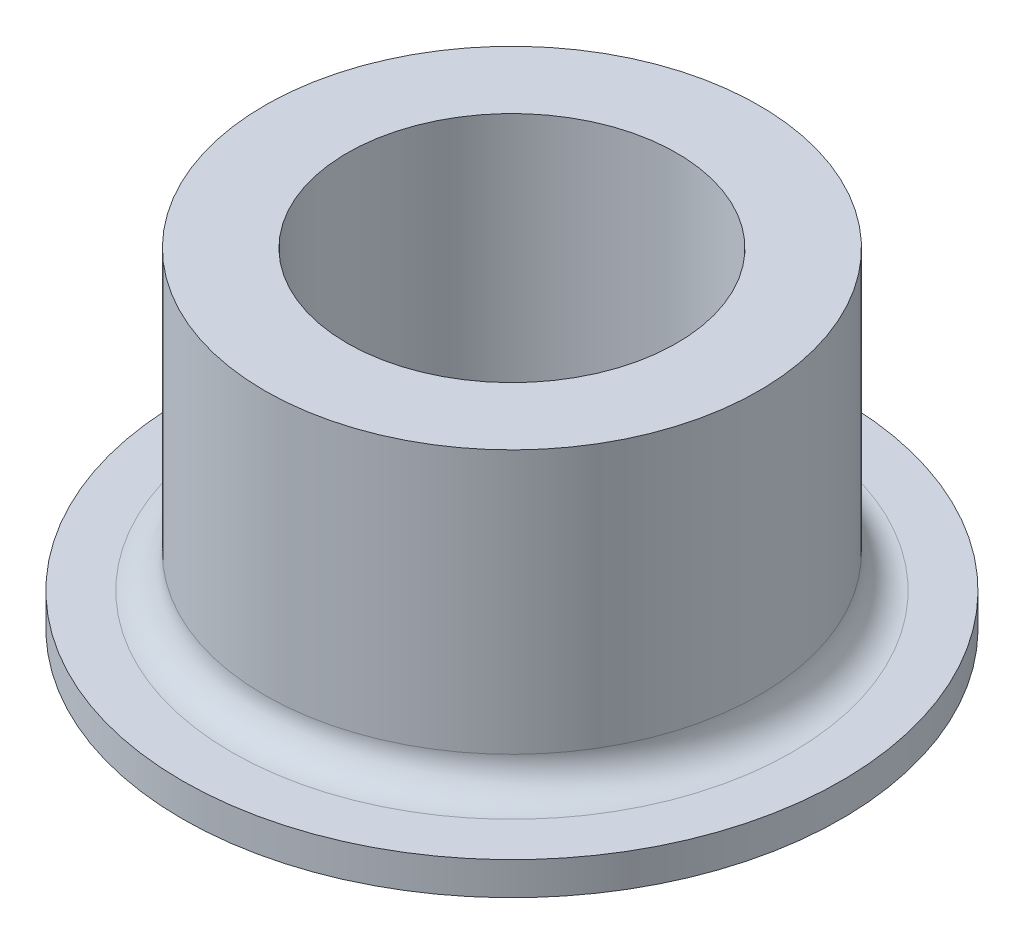
ISO-10303-21;
HEADER;
FILE_DESCRIPTION(('STEP AP214'),'2;1');
FILE_NAME('part.step','',(''),(''),'','','');
FILE_SCHEMA(('AUTOMOTIVE_DESIGN { 1 0 10303 214 1 1 1 1 }'));
ENDSEC;
DATA;
#1=APPLICATION_CONTEXT('core data for automotive mechanical design processes');
#2=APPLICATION_PROTOCOL_DEFINITION('international standard','automotive_design',2000,#1);
#3=PRODUCT_CONTEXT('',#1,'mechanical');
#4=PRODUCT('Part','Part','',(#3));
#5=PRODUCT_RELATED_PRODUCT_CATEGORY('part','',(#4));
#6=PRODUCT_DEFINITION_FORMATION('','',#4);
#7=PRODUCT_DEFINITION_CONTEXT('part definition',#1,'design');
#8=PRODUCT_DEFINITION('design','',#6,#7);
#9=PRODUCT_DEFINITION_SHAPE('','',#8);
#10=(LENGTH_UNIT() NAMED_UNIT(*) SI_UNIT(.MILLI.,.METRE.));
#11=(NAMED_UNIT(*) PLANE_ANGLE_UNIT() SI_UNIT($,.RADIAN.));
#12=(NAMED_UNIT(*) SI_UNIT($,.STERADIAN.) SOLID_ANGLE_UNIT());
#13=UNCERTAINTY_MEASURE_WITH_UNIT(LENGTH_MEASURE(1.E-05),#10,'distance_accuracy_value','');
#14=(GEOMETRIC_REPRESENTATION_CONTEXT(3) GLOBAL_UNCERTAINTY_ASSIGNED_CONTEXT((#13)) GLOBAL_UNIT_ASSIGNED_CONTEXT((#10,
#11,#12)) REPRESENTATION_CONTEXT('',''));
#15=CARTESIAN_POINT('',(0.,0.,0.));
#16=DIRECTION('',(0.,0.,1.));
#17=DIRECTION('',(1.,0.,0.));
#18=AXIS2_PLACEMENT_3D('',#15,#16,#17);
#19=CARTESIAN_POINT('',(0.,1.,0.));
#20=DIRECTION('',(0.,-1.,0.));
#21=DIRECTION('',(0.,0.,-1.));
#22=AXIS2_PLACEMENT_3D('',#19,#20,#21);
#23=CYLINDRICAL_SURFACE('',#22,10.);
#24=CARTESIAN_POINT('',(0.,1.,0.));
#25=DIRECTION('',(0.,1.,0.));
#26=DIRECTION('',(0.,0.,1.));
#27=AXIS2_PLACEMENT_3D('',#24,#25,#26);
#28=CIRCLE('',#27,10.);
#29=CARTESIAN_POINT('',(0.,1.,10.));
#30=VERTEX_POINT('',#29);
#31=EDGE_CURVE('E67',#30,#30,#28,.T.);
#32=ORIENTED_EDGE('',*,*,#31,.F.);
#33=EDGE_LOOP('',(#32));
#34=FACE_BOUND('',#33,.T.);
#35=CARTESIAN_POINT('',(0.,0.,0.));
#36=DIRECTION('',(0.,1.,0.));
#37=DIRECTION('',(0.,0.,1.));
#38=AXIS2_PLACEMENT_3D('',#35,#36,#37);
#39=CIRCLE('',#38,10.);
#40=CARTESIAN_POINT('',(0.,0.,10.));
#41=VERTEX_POINT('',#40);
#42=EDGE_CURVE('E77',#41,#41,#39,.T.);
#43=ORIENTED_EDGE('',*,*,#42,.T.);
#44=EDGE_LOOP('',(#43));
#45=FACE_BOUND('',#44,.T.);
#46=ADVANCED_FACE('F54',(#34,#45),#23,.T.);
#47=CARTESIAN_POINT('',(0.,1.,0.));
#48=DIRECTION('',(0.,1.,0.));
#49=DIRECTION('',(0.,0.,1.));
#50=AXIS2_PLACEMENT_3D('',#47,#48,#49);
#51=PLANE('',#50);
#52=CARTESIAN_POINT('',(0.,1.,0.));
#53=DIRECTION('',(0.,1.,0.));
#54=DIRECTION('',(0.,0.,1.));
#55=AXIS2_PLACEMENT_3D('',#52,#53,#54);
#56=CIRCLE('',#55,8.5);
#57=CARTESIAN_POINT('',(0.,1.,8.5));
#58=VERTEX_POINT('',#57);
#59=EDGE_CURVE('E11',#58,#58,#56,.F.);
#60=ORIENTED_EDGE('',*,*,#59,.T.);
#61=EDGE_LOOP('',(#60));
#62=FACE_BOUND('',#61,.T.);
#63=ORIENTED_EDGE('',*,*,#31,.T.);
#64=EDGE_LOOP('',(#63));
#65=FACE_BOUND('',#64,.T.);
#66=ADVANCED_FACE('F113',(#62,#65),#51,.T.);
#67=CARTESIAN_POINT('',(0.,0.,0.));
#68=DIRECTION('',(0.,1.,0.));
#69=DIRECTION('',(0.,0.,1.));
#70=AXIS2_PLACEMENT_3D('',#67,#68,#69);
#71=PLANE('',#70);
#72=ORIENTED_EDGE('',*,*,#42,.F.);
#73=EDGE_LOOP('',(#72));
#74=FACE_BOUND('',#73,.T.);
#75=CARTESIAN_POINT('',(0.,0.,0.));
#76=DIRECTION('',(0.,1.,0.));
#77=DIRECTION('',(0.,0.,1.));
#78=AXIS2_PLACEMENT_3D('',#75,#76,#77);
#79=CIRCLE('',#78,5.);
#80=CARTESIAN_POINT('',(0.,0.,5.));
#81=VERTEX_POINT('',#80);
#82=EDGE_CURVE('E81',#81,#81,#79,.T.);
#83=ORIENTED_EDGE('',*,*,#82,.T.);
#84=EDGE_LOOP('',(#83));
#85=FACE_BOUND('',#84,.T.);
#86=ADVANCED_FACE('F115',(#74,#85),#71,.F.);
#87=CARTESIAN_POINT('',(0.,10.,0.));
#88=DIRECTION('',(0.,-1.,0.));
#89=DIRECTION('',(0.,0.,-1.));
#90=AXIS2_PLACEMENT_3D('',#87,#88,#89);
#91=CYLINDRICAL_SURFACE('',#90,5.);
#92=CARTESIAN_POINT('',(0.,10.,0.));
#93=DIRECTION('',(0.,1.,0.));
#94=DIRECTION('',(0.,0.,1.));
#95=AXIS2_PLACEMENT_3D('',#92,#93,#94);
#96=CIRCLE('',#95,5.);
#97=CARTESIAN_POINT('',(0.,10.,5.));
#98=VERTEX_POINT('',#97);
#99=EDGE_CURVE('E88',#98,#98,#96,.T.);
#100=ORIENTED_EDGE('',*,*,#99,.T.);
#101=EDGE_LOOP('',(#100));
#102=FACE_BOUND('',#101,.T.);
#103=ORIENTED_EDGE('',*,*,#82,.F.);
#104=EDGE_LOOP('',(#103));
#105=FACE_BOUND('',#104,.T.);
#106=ADVANCED_FACE('F92',(#102,#105),#91,.F.);
#107=CARTESIAN_POINT('',(0.,10.,0.));
#108=DIRECTION('',(0.,-1.,0.));
#109=DIRECTION('',(0.,0.,-1.));
#110=AXIS2_PLACEMENT_3D('',#107,#108,#109);
#111=CYLINDRICAL_SURFACE('',#110,7.5);
#112=CARTESIAN_POINT('',(0.,2.,0.));
#113=DIRECTION('',(0.,1.,0.));
#114=DIRECTION('',(0.,0.,1.));
#115=AXIS2_PLACEMENT_3D('',#112,#113,#114);
#116=CIRCLE('',#115,7.5);
#117=CARTESIAN_POINT('',(0.,2.,7.5));
#118=VERTEX_POINT('',#117);
#119=EDGE_CURVE('E64',#118,#118,#116,.T.);
#120=ORIENTED_EDGE('',*,*,#119,.T.);
#121=EDGE_LOOP('',(#120));
#122=FACE_BOUND('',#121,.T.);
#123=CARTESIAN_POINT('',(0.,10.,0.));
#124=DIRECTION('',(0.,1.,0.));
#125=DIRECTION('',(0.,0.,1.));
#126=AXIS2_PLACEMENT_3D('',#123,#124,#125);
#127=CIRCLE('',#126,7.5);
#128=CARTESIAN_POINT('',(0.,10.,7.5));
#129=VERTEX_POINT('',#128);
#130=EDGE_CURVE('E83',#129,#129,#127,.T.);
#131=ORIENTED_EDGE('',*,*,#130,.F.);
#132=EDGE_LOOP('',(#131));
#133=FACE_BOUND('',#132,.T.);
#134=ADVANCED_FACE('F101',(#122,#133),#111,.T.);
#135=CARTESIAN_POINT('',(0.,10.,0.));
#136=DIRECTION('',(0.,1.,0.));
#137=DIRECTION('',(0.,0.,1.));
#138=AXIS2_PLACEMENT_3D('',#135,#136,#137);
#139=PLANE('',#138);
#140=ORIENTED_EDGE('',*,*,#99,.F.);
#141=EDGE_LOOP('',(#140));
#142=FACE_BOUND('',#141,.T.);
#143=ORIENTED_EDGE('',*,*,#130,.T.);
#144=EDGE_LOOP('',(#143));
#145=FACE_BOUND('',#144,.T.);
#146=ADVANCED_FACE('F98',(#142,#145),#139,.T.);
#147=CARTESIAN_POINT('',(0.,2.,0.));
#148=DIRECTION('',(0.,1.,0.));
#149=DIRECTION('',(0.,0.,1.));
#150=AXIS2_PLACEMENT_3D('',#147,#148,#149);
#151=TOROIDAL_SURFACE('',#150,8.5,1.);
#152=ORIENTED_EDGE('',*,*,#59,.F.);
#153=EDGE_LOOP('',(#152));
#154=FACE_BOUND('',#153,.T.);
#155=ORIENTED_EDGE('',*,*,#119,.F.);
#156=EDGE_LOOP('',(#155));
#157=FACE_BOUND('',#156,.T.);
#158=ADVANCED_FACE('F60',(#154,#157),#151,.F.);
#159=CLOSED_SHELL('',(#46,#66,#86,#106,#134,#146,#158));
#160=MANIFOLD_SOLID_BREP('B2',#159);
#161=ADVANCED_BREP_SHAPE_REPRESENTATION('',(#18,#160),#14);
#162=SHAPE_DEFINITION_REPRESENTATION(#9,#161);
ENDSEC;
END-ISO-10303-21;
